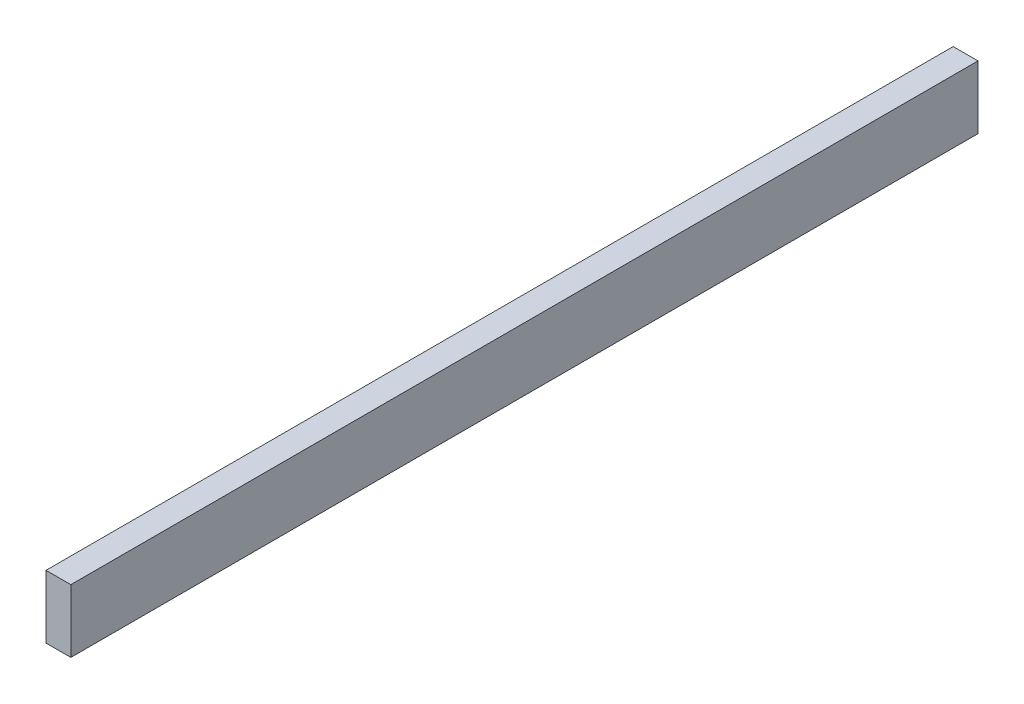
ISO-10303-21;
HEADER;
FILE_DESCRIPTION(('STEP AP214'),'2;1');
FILE_NAME('part.step','',(''),(''),'','','');
FILE_SCHEMA(('AUTOMOTIVE_DESIGN { 1 0 10303 214 1 1 1 1 }'));
ENDSEC;
DATA;
#1=APPLICATION_CONTEXT('core data for automotive mechanical design processes');
#2=APPLICATION_PROTOCOL_DEFINITION('international standard','automotive_design',2000,#1);
#3=PRODUCT_CONTEXT('',#1,'mechanical');
#4=PRODUCT('Part','Part','',(#3));
#5=PRODUCT_RELATED_PRODUCT_CATEGORY('part','',(#4));
#6=PRODUCT_DEFINITION_FORMATION('','',#4);
#7=PRODUCT_DEFINITION_CONTEXT('part definition',#1,'design');
#8=PRODUCT_DEFINITION('design','',#6,#7);
#9=PRODUCT_DEFINITION_SHAPE('','',#8);
#10=(LENGTH_UNIT() NAMED_UNIT(*) SI_UNIT(.MILLI.,.METRE.));
#11=(NAMED_UNIT(*) PLANE_ANGLE_UNIT() SI_UNIT($,.RADIAN.));
#12=(NAMED_UNIT(*) SI_UNIT($,.STERADIAN.) SOLID_ANGLE_UNIT());
#13=UNCERTAINTY_MEASURE_WITH_UNIT(LENGTH_MEASURE(1.E-05),#10,'distance_accuracy_value','');
#14=(GEOMETRIC_REPRESENTATION_CONTEXT(3) GLOBAL_UNCERTAINTY_ASSIGNED_CONTEXT((#13)) GLOBAL_UNIT_ASSIGNED_CONTEXT((#10,
#11,#12)) REPRESENTATION_CONTEXT('',''));
#15=CARTESIAN_POINT('',(0.,0.,0.));
#16=DIRECTION('',(0.,0.,1.));
#17=DIRECTION('',(1.,0.,0.));
#18=AXIS2_PLACEMENT_3D('',#15,#16,#17);
#19=CARTESIAN_POINT('',(0.,22.86,-552.));
#20=DIRECTION('',(-1.,0.,0.));
#21=DIRECTION('',(0.,0.,1.));
#22=AXIS2_PLACEMENT_3D('',#19,#20,#21);
#23=PLANE('',#22);
#24=DIRECTION('',(0.,-1.,0.));
#25=VECTOR('',#24,1.);
#26=CARTESIAN_POINT('',(0.,22.86,0.));
#27=LINE('',#26,#25);
#28=CARTESIAN_POINT('',(0.,22.86,0.));
#29=VERTEX_POINT('',#28);
#30=CARTESIAN_POINT('',(0.,-22.86,0.));
#31=VERTEX_POINT('',#30);
#32=EDGE_CURVE('E77',#29,#31,#27,.T.);
#33=ORIENTED_EDGE('',*,*,#32,.F.);
#34=DIRECTION('',(0.,0.,1.));
#35=VECTOR('',#34,1.);
#36=CARTESIAN_POINT('',(0.,22.86,-552.));
#37=LINE('',#36,#35);
#38=CARTESIAN_POINT('',(0.,22.86,-657.999999999975));
#39=VERTEX_POINT('',#38);
#40=EDGE_CURVE('E11',#39,#29,#37,.T.);
#41=ORIENTED_EDGE('',*,*,#40,.F.);
#42=DIRECTION('',(0.,-1.,0.));
#43=VECTOR('',#42,1.);
#44=CARTESIAN_POINT('',(0.,-22.86,-657.999999999975));
#45=LINE('',#44,#43);
#46=CARTESIAN_POINT('',(0.,-22.86,-657.999999999975));
#47=VERTEX_POINT('',#46);
#48=EDGE_CURVE('E75',#39,#47,#45,.T.);
#49=ORIENTED_EDGE('',*,*,#48,.T.);
#50=DIRECTION('',(0.,0.,1.));
#51=VECTOR('',#50,1.);
#52=CARTESIAN_POINT('',(0.,-22.86,-552.));
#53=LINE('',#52,#51);
#54=EDGE_CURVE('E37',#47,#31,#53,.T.);
#55=ORIENTED_EDGE('',*,*,#54,.T.);
#56=EDGE_LOOP('',(#33,#41,#49,#55));
#57=FACE_BOUND('',#56,.T.);
#58=ADVANCED_FACE('F34',(#57),#23,.T.);
#59=CARTESIAN_POINT('',(0.,22.86,-552.));
#60=DIRECTION('',(0.,1.,0.));
#61=DIRECTION('',(-1.,0.,0.));
#62=AXIS2_PLACEMENT_3D('',#59,#60,#61);
#63=PLANE('',#62);
#64=DIRECTION('',(-1.,0.,0.));
#65=VECTOR('',#64,1.);
#66=CARTESIAN_POINT('',(0.,22.86,0.));
#67=LINE('',#66,#65);
#68=CARTESIAN_POINT('',(18.,22.86,0.));
#69=VERTEX_POINT('',#68);
#70=EDGE_CURVE('E100',#69,#29,#67,.T.);
#71=ORIENTED_EDGE('',*,*,#70,.F.);
#72=DIRECTION('',(0.,0.,1.));
#73=VECTOR('',#72,1.);
#74=CARTESIAN_POINT('',(18.,22.86,-552.));
#75=LINE('',#74,#73);
#76=CARTESIAN_POINT('',(18.,22.86,-657.999999999975));
#77=VERTEX_POINT('',#76);
#78=EDGE_CURVE('E42',#77,#69,#75,.T.);
#79=ORIENTED_EDGE('',*,*,#78,.F.);
#80=DIRECTION('',(-1.,0.,0.));
#81=VECTOR('',#80,1.);
#82=CARTESIAN_POINT('',(18.,22.86,-657.999999999975));
#83=LINE('',#82,#81);
#84=EDGE_CURVE('E84',#77,#39,#83,.T.);
#85=ORIENTED_EDGE('',*,*,#84,.T.);
#86=ORIENTED_EDGE('',*,*,#40,.T.);
#87=EDGE_LOOP('',(#71,#79,#85,#86));
#88=FACE_BOUND('',#87,.T.);
#89=ADVANCED_FACE('F88',(#88),#63,.T.);
#90=CARTESIAN_POINT('',(18.,22.86,-552.));
#91=DIRECTION('',(1.,0.,0.));
#92=DIRECTION('',(0.,0.,-1.));
#93=AXIS2_PLACEMENT_3D('',#90,#91,#92);
#94=PLANE('',#93);
#95=DIRECTION('',(0.,1.,0.));
#96=VECTOR('',#95,1.);
#97=CARTESIAN_POINT('',(18.,22.86,0.));
#98=LINE('',#97,#96);
#99=CARTESIAN_POINT('',(18.,-22.86,0.));
#100=VERTEX_POINT('',#99);
#101=EDGE_CURVE('E98',#100,#69,#98,.T.);
#102=ORIENTED_EDGE('',*,*,#101,.F.);
#103=DIRECTION('',(0.,0.,1.));
#104=VECTOR('',#103,1.);
#105=CARTESIAN_POINT('',(18.,-22.86,-552.));
#106=LINE('',#105,#104);
#107=CARTESIAN_POINT('',(18.,-22.86,-657.999999999975));
#108=VERTEX_POINT('',#107);
#109=EDGE_CURVE('E102',#108,#100,#106,.T.);
#110=ORIENTED_EDGE('',*,*,#109,.F.);
#111=DIRECTION('',(0.,1.,0.));
#112=VECTOR('',#111,1.);
#113=CARTESIAN_POINT('',(18.,-22.86,-657.999999999975));
#114=LINE('',#113,#112);
#115=EDGE_CURVE('E92',#108,#77,#114,.T.);
#116=ORIENTED_EDGE('',*,*,#115,.T.);
#117=ORIENTED_EDGE('',*,*,#78,.T.);
#118=EDGE_LOOP('',(#102,#110,#116,#117));
#119=FACE_BOUND('',#118,.T.);
#120=ADVANCED_FACE('F108',(#119),#94,.T.);
#121=CARTESIAN_POINT('',(0.,-22.86,-552.));
#122=DIRECTION('',(0.,-1.,0.));
#123=DIRECTION('',(0.,0.,-1.));
#124=AXIS2_PLACEMENT_3D('',#121,#122,#123);
#125=PLANE('',#124);
#126=DIRECTION('',(1.,0.,0.));
#127=VECTOR('',#126,1.);
#128=CARTESIAN_POINT('',(0.,-22.86,0.));
#129=LINE('',#128,#127);
#130=EDGE_CURVE('E95',#31,#100,#129,.T.);
#131=ORIENTED_EDGE('',*,*,#130,.F.);
#132=ORIENTED_EDGE('',*,*,#54,.F.);
#133=DIRECTION('',(1.,0.,0.));
#134=VECTOR('',#133,1.);
#135=CARTESIAN_POINT('',(18.,-22.86,-657.999999999975));
#136=LINE('',#135,#134);
#137=EDGE_CURVE('E86',#47,#108,#136,.T.);
#138=ORIENTED_EDGE('',*,*,#137,.T.);
#139=ORIENTED_EDGE('',*,*,#109,.T.);
#140=EDGE_LOOP('',(#131,#132,#138,#139));
#141=FACE_BOUND('',#140,.T.);
#142=ADVANCED_FACE('F105',(#141),#125,.T.);
#143=CARTESIAN_POINT('',(0.,0.,0.));
#144=DIRECTION('',(0.,0.,1.));
#145=DIRECTION('',(1.,0.,0.));
#146=AXIS2_PLACEMENT_3D('',#143,#144,#145);
#147=PLANE('',#146);
#148=ORIENTED_EDGE('',*,*,#32,.T.);
#149=ORIENTED_EDGE('',*,*,#130,.T.);
#150=ORIENTED_EDGE('',*,*,#101,.T.);
#151=ORIENTED_EDGE('',*,*,#70,.T.);
#152=EDGE_LOOP('',(#148,#149,#150,#151));
#153=FACE_BOUND('',#152,.T.);
#154=ADVANCED_FACE('F107',(#153),#147,.T.);
#155=CARTESIAN_POINT('',(-12.7000000000002,-10.5,-657.999999999975));
#156=DIRECTION('',(0.,0.,1.));
#157=DIRECTION('',(0.,1.,0.));
#158=AXIS2_PLACEMENT_3D('',#155,#156,#157);
#159=PLANE('',#158);
#160=ORIENTED_EDGE('',*,*,#137,.F.);
#161=ORIENTED_EDGE('',*,*,#48,.F.);
#162=ORIENTED_EDGE('',*,*,#84,.F.);
#163=ORIENTED_EDGE('',*,*,#115,.F.);
#164=EDGE_LOOP('',(#160,#161,#162,#163));
#165=FACE_BOUND('',#164,.T.);
#166=ADVANCED_FACE('F82',(#165),#159,.F.);
#167=CLOSED_SHELL('',(#58,#89,#120,#142,#154,#166));
#168=MANIFOLD_SOLID_BREP('B2',#167);
#169=ADVANCED_BREP_SHAPE_REPRESENTATION('',(#18,#168),#14);
#170=SHAPE_DEFINITION_REPRESENTATION(#9,#169);
ENDSEC;
END-ISO-10303-21;
